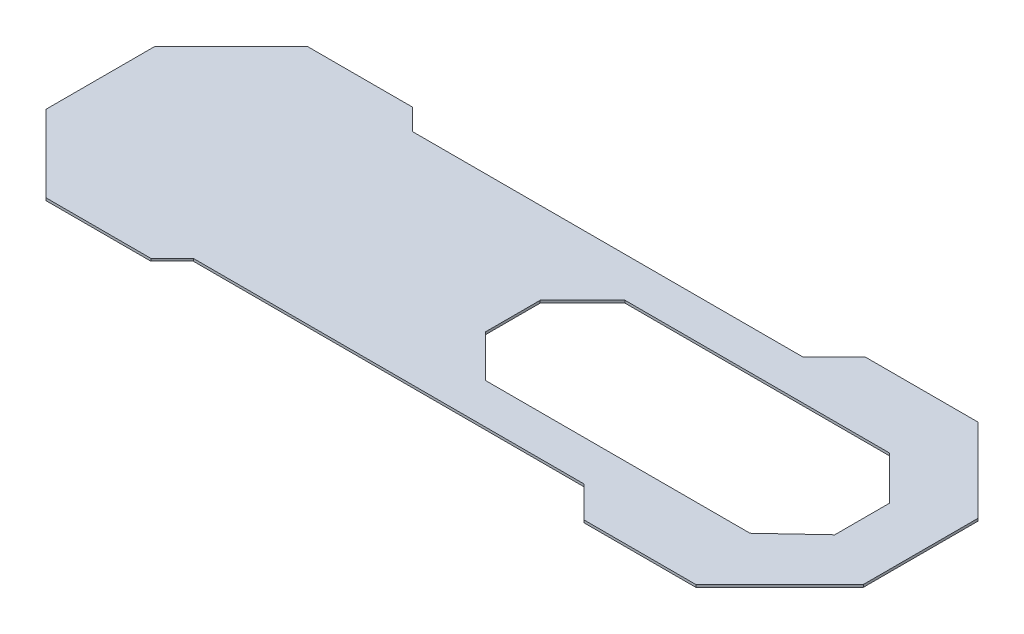
ISO-10303-21;
HEADER;
FILE_DESCRIPTION(('STEP AP214'),'2;1');
FILE_NAME('part.step','',(''),(''),'','','');
FILE_SCHEMA(('AUTOMOTIVE_DESIGN { 1 0 10303 214 1 1 1 1 }'));
ENDSEC;
DATA;
#1=APPLICATION_CONTEXT('core data for automotive mechanical design processes');
#2=APPLICATION_PROTOCOL_DEFINITION('international standard','automotive_design',2000,#1);
#3=PRODUCT_CONTEXT('',#1,'mechanical');
#4=PRODUCT('Part','Part','',(#3));
#5=PRODUCT_RELATED_PRODUCT_CATEGORY('part','',(#4));
#6=PRODUCT_DEFINITION_FORMATION('','',#4);
#7=PRODUCT_DEFINITION_CONTEXT('part definition',#1,'design');
#8=PRODUCT_DEFINITION('design','',#6,#7);
#9=PRODUCT_DEFINITION_SHAPE('','',#8);
#10=(LENGTH_UNIT() NAMED_UNIT(*) SI_UNIT(.MILLI.,.METRE.));
#11=(NAMED_UNIT(*) PLANE_ANGLE_UNIT() SI_UNIT($,.RADIAN.));
#12=(NAMED_UNIT(*) SI_UNIT($,.STERADIAN.) SOLID_ANGLE_UNIT());
#13=UNCERTAINTY_MEASURE_WITH_UNIT(LENGTH_MEASURE(1.E-05),#10,'distance_accuracy_value','');
#14=(GEOMETRIC_REPRESENTATION_CONTEXT(3) GLOBAL_UNCERTAINTY_ASSIGNED_CONTEXT((#13)) GLOBAL_UNIT_ASSIGNED_CONTEXT((#10,
#11,#12)) REPRESENTATION_CONTEXT('',''));
#15=CARTESIAN_POINT('',(0.,0.,0.));
#16=DIRECTION('',(0.,0.,1.));
#17=DIRECTION('',(1.,0.,0.));
#18=AXIS2_PLACEMENT_3D('',#15,#16,#17);
#19=CARTESIAN_POINT('',(-264.356991894611,-1.,258.389640506113));
#20=DIRECTION('',(0.,0.,1.));
#21=DIRECTION('',(1.,0.,0.));
#22=AXIS2_PLACEMENT_3D('',#19,#20,#21);
#23=PLANE('',#22);
#24=DIRECTION('',(1.,0.,0.));
#25=VECTOR('',#24,1.);
#26=CARTESIAN_POINT('',(-264.356991894611,0.,258.389640506113));
#27=LINE('',#26,#25);
#28=CARTESIAN_POINT('',(-264.356991894611,0.,258.389640506113));
#29=VERTEX_POINT('',#28);
#30=CARTESIAN_POINT('',(-222.27878140781,0.,258.389640506113));
#31=VERTEX_POINT('',#30);
#32=EDGE_CURVE('E271',#29,#31,#27,.T.);
#33=ORIENTED_EDGE('',*,*,#32,.F.);
#34=DIRECTION('',(0.,1.,0.));
#35=VECTOR('',#34,1.);
#36=CARTESIAN_POINT('',(-264.356991894611,-1.,258.389640506113));
#37=LINE('',#36,#35);
#38=CARTESIAN_POINT('',(-264.356991894611,-1.,258.389640506113));
#39=VERTEX_POINT('',#38);
#40=EDGE_CURVE('E43',#39,#29,#37,.T.);
#41=ORIENTED_EDGE('',*,*,#40,.F.);
#42=DIRECTION('',(1.,0.,0.));
#43=VECTOR('',#42,1.);
#44=CARTESIAN_POINT('',(-264.356991894611,-1.,258.389640506113));
#45=LINE('',#44,#43);
#46=CARTESIAN_POINT('',(-222.27878140781,-1.,258.389640506113));
#47=VERTEX_POINT('',#46);
#48=EDGE_CURVE('E308',#39,#47,#45,.T.);
#49=ORIENTED_EDGE('',*,*,#48,.T.);
#50=DIRECTION('',(0.,1.,0.));
#51=VECTOR('',#50,1.);
#52=CARTESIAN_POINT('',(-222.27878140781,-1.,258.389640506113));
#53=LINE('',#52,#51);
#54=EDGE_CURVE('E11',#47,#31,#53,.T.);
#55=ORIENTED_EDGE('',*,*,#54,.T.);
#56=EDGE_LOOP('',(#33,#41,#49,#55));
#57=FACE_BOUND('',#56,.T.);
#58=ADVANCED_FACE('F34',(#57),#23,.T.);
#59=CARTESIAN_POINT('',(-295.110779870024,-1.,227.635852530701));
#60=DIRECTION('',(-0.707106781186544,0.,0.707106781186551));
#61=DIRECTION('',(0.707106781186551,0.,0.707106781186544));
#62=AXIS2_PLACEMENT_3D('',#59,#60,#61);
#63=PLANE('',#62);
#64=DIRECTION('',(0.707106781186551,0.,0.707106781186544));
#65=VECTOR('',#64,1.);
#66=CARTESIAN_POINT('',(-295.110779870024,0.,227.635852530701));
#67=LINE('',#66,#65);
#68=CARTESIAN_POINT('',(-295.110779870024,0.,227.635852530701));
#69=VERTEX_POINT('',#68);
#70=EDGE_CURVE('E352',#69,#29,#67,.T.);
#71=ORIENTED_EDGE('',*,*,#70,.F.);
#72=DIRECTION('',(0.,1.,0.));
#73=VECTOR('',#72,1.);
#74=CARTESIAN_POINT('',(-295.110779870024,-1.,227.635852530701));
#75=LINE('',#74,#73);
#76=CARTESIAN_POINT('',(-295.110779870024,-1.,227.635852530701));
#77=VERTEX_POINT('',#76);
#78=EDGE_CURVE('E358',#77,#69,#75,.T.);
#79=ORIENTED_EDGE('',*,*,#78,.F.);
#80=DIRECTION('',(0.707106781186551,0.,0.707106781186544));
#81=VECTOR('',#80,1.);
#82=CARTESIAN_POINT('',(-295.110779870024,-1.,227.635852530701));
#83=LINE('',#82,#81);
#84=EDGE_CURVE('E305',#77,#39,#83,.T.);
#85=ORIENTED_EDGE('',*,*,#84,.T.);
#86=ORIENTED_EDGE('',*,*,#40,.T.);
#87=EDGE_LOOP('',(#71,#79,#85,#86));
#88=FACE_BOUND('',#87,.T.);
#89=ADVANCED_FACE('F450',(#88),#63,.T.);
#90=CARTESIAN_POINT('',(-295.110779870024,-1.,184.143428481526));
#91=DIRECTION('',(-1.,0.,0.));
#92=DIRECTION('',(0.,0.,1.));
#93=AXIS2_PLACEMENT_3D('',#90,#91,#92);
#94=PLANE('',#93);
#95=DIRECTION('',(0.,0.,1.));
#96=VECTOR('',#95,1.);
#97=CARTESIAN_POINT('',(-295.110779870024,0.,184.143428481526));
#98=LINE('',#97,#96);
#99=CARTESIAN_POINT('',(-295.110779870024,0.,184.143428481526));
#100=VERTEX_POINT('',#99);
#101=EDGE_CURVE('E349',#100,#69,#98,.T.);
#102=ORIENTED_EDGE('',*,*,#101,.F.);
#103=DIRECTION('',(0.,1.,0.));
#104=VECTOR('',#103,1.);
#105=CARTESIAN_POINT('',(-295.110779870024,-1.,184.143428481526));
#106=LINE('',#105,#104);
#107=CARTESIAN_POINT('',(-295.110779870024,-1.,184.143428481526));
#108=VERTEX_POINT('',#107);
#109=EDGE_CURVE('E360',#108,#100,#106,.T.);
#110=ORIENTED_EDGE('',*,*,#109,.F.);
#111=DIRECTION('',(0.,0.,1.));
#112=VECTOR('',#111,1.);
#113=CARTESIAN_POINT('',(-295.110779870024,-1.,184.143428481526));
#114=LINE('',#113,#112);
#115=EDGE_CURVE('E302',#108,#77,#114,.T.);
#116=ORIENTED_EDGE('',*,*,#115,.T.);
#117=ORIENTED_EDGE('',*,*,#78,.T.);
#118=EDGE_LOOP('',(#102,#110,#116,#117));
#119=FACE_BOUND('',#118,.T.);
#120=ADVANCED_FACE('F448',(#119),#94,.T.);
#121=CARTESIAN_POINT('',(-295.110779870024,-1.,184.143428481526));
#122=DIRECTION('',(-0.707106781186552,0.,-0.707106781186543));
#123=DIRECTION('',(-0.707106781186543,0.,0.707106781186552));
#124=AXIS2_PLACEMENT_3D('',#121,#122,#123);
#125=PLANE('',#124);
#126=DIRECTION('',(-0.707106781186543,0.,0.707106781186552));
#127=VECTOR('',#126,1.);
#128=CARTESIAN_POINT('',(-295.110779870024,0.,184.143428481526));
#129=LINE('',#128,#127);
#130=CARTESIAN_POINT('',(-264.356991894612,0.,153.389640506113));
#131=VERTEX_POINT('',#130);
#132=EDGE_CURVE('E346',#131,#100,#129,.T.);
#133=ORIENTED_EDGE('',*,*,#132,.F.);
#134=DIRECTION('',(0.,1.,0.));
#135=VECTOR('',#134,1.);
#136=CARTESIAN_POINT('',(-264.356991894612,-1.,153.389640506113));
#137=LINE('',#136,#135);
#138=CARTESIAN_POINT('',(-264.356991894612,-1.,153.389640506113));
#139=VERTEX_POINT('',#138);
#140=EDGE_CURVE('E362',#139,#131,#137,.T.);
#141=ORIENTED_EDGE('',*,*,#140,.F.);
#142=DIRECTION('',(-0.707106781186543,0.,0.707106781186552));
#143=VECTOR('',#142,1.);
#144=CARTESIAN_POINT('',(-295.110779870024,-1.,184.143428481526));
#145=LINE('',#144,#143);
#146=EDGE_CURVE('E299',#139,#108,#145,.T.);
#147=ORIENTED_EDGE('',*,*,#146,.T.);
#148=ORIENTED_EDGE('',*,*,#109,.T.);
#149=EDGE_LOOP('',(#133,#141,#147,#148));
#150=FACE_BOUND('',#149,.T.);
#151=ADVANCED_FACE('F444',(#150),#125,.T.);
#152=CARTESIAN_POINT('',(-264.356991894612,-1.,153.389640506113));
#153=DIRECTION('',(0.,0.,-1.));
#154=DIRECTION('',(-1.,0.,0.));
#155=AXIS2_PLACEMENT_3D('',#152,#153,#154);
#156=PLANE('',#155);
#157=DIRECTION('',(-1.,0.,0.));
#158=VECTOR('',#157,1.);
#159=CARTESIAN_POINT('',(-264.356991894612,0.,153.389640506113));
#160=LINE('',#159,#158);
#161=CARTESIAN_POINT('',(-222.27878140781,0.,153.389640506113));
#162=VERTEX_POINT('',#161);
#163=EDGE_CURVE('E343',#162,#131,#160,.T.);
#164=ORIENTED_EDGE('',*,*,#163,.F.);
#165=DIRECTION('',(0.,1.,0.));
#166=VECTOR('',#165,1.);
#167=CARTESIAN_POINT('',(-222.27878140781,-1.,153.389640506113));
#168=LINE('',#167,#166);
#169=CARTESIAN_POINT('',(-222.27878140781,-1.,153.389640506113));
#170=VERTEX_POINT('',#169);
#171=EDGE_CURVE('E364',#170,#162,#168,.T.);
#172=ORIENTED_EDGE('',*,*,#171,.F.);
#173=DIRECTION('',(-1.,0.,0.));
#174=VECTOR('',#173,1.);
#175=CARTESIAN_POINT('',(-264.356991894612,-1.,153.389640506113));
#176=LINE('',#175,#174);
#177=EDGE_CURVE('E296',#170,#139,#176,.T.);
#178=ORIENTED_EDGE('',*,*,#177,.T.);
#179=ORIENTED_EDGE('',*,*,#140,.T.);
#180=EDGE_LOOP('',(#164,#172,#178,#179));
#181=FACE_BOUND('',#180,.T.);
#182=ADVANCED_FACE('F441',(#181),#156,.T.);
#183=CARTESIAN_POINT('',(-222.27878140781,-1.,153.389640506113));
#184=DIRECTION('',(0.707106781186539,0.,-0.707106781186556));
#185=DIRECTION('',(-0.707106781186556,0.,-0.707106781186539));
#186=AXIS2_PLACEMENT_3D('',#183,#184,#185);
#187=PLANE('',#186);
#188=DIRECTION('',(-0.707106781186556,0.,-0.707106781186539));
#189=VECTOR('',#188,1.);
#190=CARTESIAN_POINT('',(-222.27878140781,0.,153.389640506113));
#191=LINE('',#190,#189);
#192=CARTESIAN_POINT('',(-213.778781407809,0.,161.889640506113));
#193=VERTEX_POINT('',#192);
#194=EDGE_CURVE('E340',#193,#162,#191,.T.);
#195=ORIENTED_EDGE('',*,*,#194,.F.);
#196=DIRECTION('',(0.,1.,0.));
#197=VECTOR('',#196,1.);
#198=CARTESIAN_POINT('',(-213.778781407809,-1.,161.889640506113));
#199=LINE('',#198,#197);
#200=CARTESIAN_POINT('',(-213.778781407809,-1.,161.889640506113));
#201=VERTEX_POINT('',#200);
#202=EDGE_CURVE('E366',#201,#193,#199,.T.);
#203=ORIENTED_EDGE('',*,*,#202,.F.);
#204=DIRECTION('',(-0.707106781186547,0.,-0.707106781186547));
#205=VECTOR('',#204,1.);
#206=CARTESIAN_POINT('',(-214.218121236029,-1.,161.450300677893));
#207=LINE('',#206,#205);
#208=EDGE_CURVE('E294',#201,#170,#207,.T.);
#209=ORIENTED_EDGE('',*,*,#208,.T.);
#210=ORIENTED_EDGE('',*,*,#171,.T.);
#211=EDGE_LOOP('',(#195,#203,#209,#210));
#212=FACE_BOUND('',#211,.T.);
#213=ADVANCED_FACE('F436',(#212),#187,.T.);
#214=CARTESIAN_POINT('',(-213.157461064249,-1.,161.889640506113));
#215=DIRECTION('',(0.,0.,-1.));
#216=DIRECTION('',(-1.,0.,0.));
#217=AXIS2_PLACEMENT_3D('',#214,#215,#216);
#218=PLANE('',#217);
#219=DIRECTION('',(-1.,0.,0.));
#220=VECTOR('',#219,1.);
#221=CARTESIAN_POINT('',(-213.157461064249,0.,161.889640506113));
#222=LINE('',#221,#220);
#223=CARTESIAN_POINT('',(-57.0996325817314,0.,161.889640506113));
#224=VERTEX_POINT('',#223);
#225=EDGE_CURVE('E337',#224,#193,#222,.T.);
#226=ORIENTED_EDGE('',*,*,#225,.F.);
#227=DIRECTION('',(0.,1.,0.));
#228=VECTOR('',#227,1.);
#229=CARTESIAN_POINT('',(-57.0996325817314,-1.,161.889640506113));
#230=LINE('',#229,#228);
#231=CARTESIAN_POINT('',(-57.0996325817314,-1.,161.889640506113));
#232=VERTEX_POINT('',#231);
#233=EDGE_CURVE('E369',#232,#224,#230,.T.);
#234=ORIENTED_EDGE('',*,*,#233,.F.);
#235=DIRECTION('',(-1.,0.,-2.68031548330951E-13));
#236=VECTOR('',#235,1.);
#237=CARTESIAN_POINT('',(-57.7209529252909,-1.,161.889640506113));
#238=LINE('',#237,#236);
#239=EDGE_CURVE('E292',#232,#201,#238,.T.);
#240=ORIENTED_EDGE('',*,*,#239,.T.);
#241=ORIENTED_EDGE('',*,*,#202,.T.);
#242=EDGE_LOOP('',(#226,#234,#240,#241));
#243=FACE_BOUND('',#242,.T.);
#244=ADVANCED_FACE('F434',(#243),#218,.T.);
#245=CARTESIAN_POINT('',(-56.6602927535113,-1.,161.450300677893));
#246=DIRECTION('',(-0.707106781186536,0.,-0.707106781186559));
#247=DIRECTION('',(-0.707106781186559,0.,0.707106781186536));
#248=AXIS2_PLACEMENT_3D('',#245,#246,#247);
#249=PLANE('',#248);
#250=DIRECTION('',(-0.707106781186559,0.,0.707106781186536));
#251=VECTOR('',#250,1.);
#252=CARTESIAN_POINT('',(-56.6602927535113,0.,161.450300677893));
#253=LINE('',#252,#251);
#254=CARTESIAN_POINT('',(-44.5996325817312,0.,149.389640506113));
#255=VERTEX_POINT('',#254);
#256=EDGE_CURVE('E334',#255,#224,#253,.T.);
#257=ORIENTED_EDGE('',*,*,#256,.F.);
#258=DIRECTION('',(0.,1.,0.));
#259=VECTOR('',#258,1.);
#260=CARTESIAN_POINT('',(-44.5996325817312,-1.,149.389640506113));
#261=LINE('',#260,#259);
#262=CARTESIAN_POINT('',(-44.5996325817312,-1.,149.389640506113));
#263=VERTEX_POINT('',#262);
#264=EDGE_CURVE('E372',#263,#255,#261,.T.);
#265=ORIENTED_EDGE('',*,*,#264,.F.);
#266=DIRECTION('',(-0.70710678118655,0.,0.707106781186545));
#267=VECTOR('',#266,1.);
#268=CARTESIAN_POINT('',(-44.5996325817312,-1.,149.389640506113));
#269=LINE('',#268,#267);
#270=EDGE_CURVE('E290',#263,#232,#269,.T.);
#271=ORIENTED_EDGE('',*,*,#270,.T.);
#272=ORIENTED_EDGE('',*,*,#233,.T.);
#273=EDGE_LOOP('',(#257,#265,#271,#272));
#274=FACE_BOUND('',#273,.T.);
#275=ADVANCED_FACE('F427',(#274),#249,.T.);
#276=CARTESIAN_POINT('',(0.478072841682279,-1.,149.389640506113));
#277=DIRECTION('',(0.,0.,-1.));
#278=DIRECTION('',(-1.,0.,0.));
#279=AXIS2_PLACEMENT_3D('',#276,#277,#278);
#280=PLANE('',#279);
#281=DIRECTION('',(-1.,0.,0.));
#282=VECTOR('',#281,1.);
#283=CARTESIAN_POINT('',(0.478072841682279,0.,149.389640506113));
#284=LINE('',#283,#282);
#285=CARTESIAN_POINT('',(0.478072841682279,0.,149.389640506113));
#286=VERTEX_POINT('',#285);
#287=EDGE_CURVE('E331',#286,#255,#284,.T.);
#288=ORIENTED_EDGE('',*,*,#287,.F.);
#289=DIRECTION('',(0.,1.,0.));
#290=VECTOR('',#289,1.);
#291=CARTESIAN_POINT('',(0.478072841682279,-1.,149.389640506113));
#292=LINE('',#291,#290);
#293=CARTESIAN_POINT('',(0.478072841682279,-1.,149.389640506113));
#294=VERTEX_POINT('',#293);
#295=EDGE_CURVE('E375',#294,#286,#292,.T.);
#296=ORIENTED_EDGE('',*,*,#295,.F.);
#297=DIRECTION('',(-1.,0.,0.));
#298=VECTOR('',#297,1.);
#299=CARTESIAN_POINT('',(0.478072841682279,-1.,149.389640506113));
#300=LINE('',#299,#298);
#301=EDGE_CURVE('E287',#294,#263,#300,.T.);
#302=ORIENTED_EDGE('',*,*,#301,.T.);
#303=ORIENTED_EDGE('',*,*,#264,.T.);
#304=EDGE_LOOP('',(#288,#296,#302,#303));
#305=FACE_BOUND('',#304,.T.);
#306=ADVANCED_FACE('F424',(#305),#280,.T.);
#307=CARTESIAN_POINT('',(33.8892201299761,-1.,182.800787794406));
#308=DIRECTION('',(0.707106781186545,0.,-0.70710678118655));
#309=DIRECTION('',(-0.70710678118655,0.,-0.707106781186545));
#310=AXIS2_PLACEMENT_3D('',#307,#308,#309);
#311=PLANE('',#310);
#312=DIRECTION('',(-0.70710678118655,0.,-0.707106781186545));
#313=VECTOR('',#312,1.);
#314=CARTESIAN_POINT('',(33.8892201299761,0.,182.800787794406));
#315=LINE('',#314,#313);
#316=CARTESIAN_POINT('',(33.8892201299761,0.,182.800787794406));
#317=VERTEX_POINT('',#316);
#318=EDGE_CURVE('E328',#317,#286,#315,.T.);
#319=ORIENTED_EDGE('',*,*,#318,.F.);
#320=DIRECTION('',(0.,1.,0.));
#321=VECTOR('',#320,1.);
#322=CARTESIAN_POINT('',(33.8892201299761,-1.,182.800787794406));
#323=LINE('',#322,#321);
#324=CARTESIAN_POINT('',(33.8892201299761,-1.,182.800787794406));
#325=VERTEX_POINT('',#324);
#326=EDGE_CURVE('E377',#325,#317,#323,.T.);
#327=ORIENTED_EDGE('',*,*,#326,.F.);
#328=DIRECTION('',(-0.70710678118655,0.,-0.707106781186545));
#329=VECTOR('',#328,1.);
#330=CARTESIAN_POINT('',(33.8892201299761,-1.,182.800787794406));
#331=LINE('',#330,#329);
#332=EDGE_CURVE('E284',#325,#294,#331,.T.);
#333=ORIENTED_EDGE('',*,*,#332,.T.);
#334=ORIENTED_EDGE('',*,*,#295,.T.);
#335=EDGE_LOOP('',(#319,#327,#333,#334));
#336=FACE_BOUND('',#335,.T.);
#337=ADVANCED_FACE('F420',(#336),#311,.T.);
#338=CARTESIAN_POINT('',(33.8892201299764,-1.,228.778493217818));
#339=DIRECTION('',(1.,0.,0.));
#340=DIRECTION('',(0.,0.,-1.));
#341=AXIS2_PLACEMENT_3D('',#338,#339,#340);
#342=PLANE('',#341);
#343=DIRECTION('',(0.,0.,-1.));
#344=VECTOR('',#343,1.);
#345=CARTESIAN_POINT('',(33.8892201299764,0.,228.778493217818));
#346=LINE('',#345,#344);
#347=CARTESIAN_POINT('',(33.8892201299764,0.,228.778493217818));
#348=VERTEX_POINT('',#347);
#349=EDGE_CURVE('E325',#348,#317,#346,.T.);
#350=ORIENTED_EDGE('',*,*,#349,.F.);
#351=DIRECTION('',(0.,1.,0.));
#352=VECTOR('',#351,1.);
#353=CARTESIAN_POINT('',(33.8892201299764,-1.,228.778493217818));
#354=LINE('',#353,#352);
#355=CARTESIAN_POINT('',(33.8892201299764,-1.,228.778493217818));
#356=VERTEX_POINT('',#355);
#357=EDGE_CURVE('E379',#356,#348,#354,.T.);
#358=ORIENTED_EDGE('',*,*,#357,.F.);
#359=DIRECTION('',(0.,0.,-1.));
#360=VECTOR('',#359,1.);
#361=CARTESIAN_POINT('',(33.8892201299764,-1.,228.778493217818));
#362=LINE('',#361,#360);
#363=EDGE_CURVE('E281',#356,#325,#362,.T.);
#364=ORIENTED_EDGE('',*,*,#363,.T.);
#365=ORIENTED_EDGE('',*,*,#326,.T.);
#366=EDGE_LOOP('',(#350,#358,#364,#365));
#367=FACE_BOUND('',#366,.T.);
#368=ADVANCED_FACE('F416',(#367),#342,.T.);
#369=CARTESIAN_POINT('',(33.8892201299764,-1.,228.778493217818));
#370=DIRECTION('',(0.70710678118655,0.,0.707106781186545));
#371=DIRECTION('',(0.707106781186545,0.,-0.70710678118655));
#372=AXIS2_PLACEMENT_3D('',#369,#370,#371);
#373=PLANE('',#372);
#374=DIRECTION('',(0.707106781186545,0.,-0.70710678118655));
#375=VECTOR('',#374,1.);
#376=CARTESIAN_POINT('',(33.8892201299764,0.,228.778493217818));
#377=LINE('',#376,#375);
#378=CARTESIAN_POINT('',(0.278072841682948,0.,262.389640506112));
#379=VERTEX_POINT('',#378);
#380=EDGE_CURVE('E322',#379,#348,#377,.T.);
#381=ORIENTED_EDGE('',*,*,#380,.F.);
#382=DIRECTION('',(0.,1.,0.));
#383=VECTOR('',#382,1.);
#384=CARTESIAN_POINT('',(0.278072841682948,-1.,262.389640506112));
#385=LINE('',#384,#383);
#386=CARTESIAN_POINT('',(0.278072841682948,-1.,262.389640506112));
#387=VERTEX_POINT('',#386);
#388=EDGE_CURVE('E381',#387,#379,#385,.T.);
#389=ORIENTED_EDGE('',*,*,#388,.F.);
#390=DIRECTION('',(0.707106781186545,0.,-0.70710678118655));
#391=VECTOR('',#390,1.);
#392=CARTESIAN_POINT('',(33.8892201299764,-1.,228.778493217818));
#393=LINE('',#392,#391);
#394=EDGE_CURVE('E278',#387,#356,#393,.T.);
#395=ORIENTED_EDGE('',*,*,#394,.T.);
#396=ORIENTED_EDGE('',*,*,#357,.T.);
#397=EDGE_LOOP('',(#381,#389,#395,#396));
#398=FACE_BOUND('',#397,.T.);
#399=ADVANCED_FACE('F412',(#398),#373,.T.);
#400=CARTESIAN_POINT('',(-44.5996325817311,-1.,262.389640506112));
#401=DIRECTION('',(0.,0.,1.));
#402=DIRECTION('',(1.,0.,0.));
#403=AXIS2_PLACEMENT_3D('',#400,#401,#402);
#404=PLANE('',#403);
#405=DIRECTION('',(1.,0.,0.));
#406=VECTOR('',#405,1.);
#407=CARTESIAN_POINT('',(-44.5996325817311,0.,262.389640506112));
#408=LINE('',#407,#406);
#409=CARTESIAN_POINT('',(-44.5996325817311,0.,262.389640506112));
#410=VERTEX_POINT('',#409);
#411=EDGE_CURVE('E319',#410,#379,#408,.T.);
#412=ORIENTED_EDGE('',*,*,#411,.F.);
#413=DIRECTION('',(0.,1.,0.));
#414=VECTOR('',#413,1.);
#415=CARTESIAN_POINT('',(-44.5996325817311,-1.,262.389640506112));
#416=LINE('',#415,#414);
#417=CARTESIAN_POINT('',(-44.5996325817311,-1.,262.389640506112));
#418=VERTEX_POINT('',#417);
#419=EDGE_CURVE('E383',#418,#410,#416,.T.);
#420=ORIENTED_EDGE('',*,*,#419,.F.);
#421=DIRECTION('',(1.,0.,0.));
#422=VECTOR('',#421,1.);
#423=CARTESIAN_POINT('',(-44.5996325817311,-1.,262.389640506112));
#424=LINE('',#423,#422);
#425=EDGE_CURVE('E275',#418,#387,#424,.T.);
#426=ORIENTED_EDGE('',*,*,#425,.T.);
#427=ORIENTED_EDGE('',*,*,#388,.T.);
#428=EDGE_LOOP('',(#412,#420,#426,#427));
#429=FACE_BOUND('',#428,.T.);
#430=ADVANCED_FACE('F409',(#429),#404,.T.);
#431=CARTESIAN_POINT('',(-56.6602927535107,-1.,250.328980334333));
#432=DIRECTION('',(-0.70710678118655,0.,0.707106781186545));
#433=DIRECTION('',(0.707106781186545,0.,0.70710678118655));
#434=AXIS2_PLACEMENT_3D('',#431,#432,#433);
#435=PLANE('',#434);
#436=DIRECTION('',(0.707106781186545,0.,0.70710678118655));
#437=VECTOR('',#436,1.);
#438=CARTESIAN_POINT('',(-56.6602927535107,0.,250.328980334333));
#439=LINE('',#438,#437);
#440=CARTESIAN_POINT('',(-57.099632581731,0.,249.889640506112));
#441=VERTEX_POINT('',#440);
#442=EDGE_CURVE('E316',#441,#410,#439,.T.);
#443=ORIENTED_EDGE('',*,*,#442,.F.);
#444=DIRECTION('',(0.,1.,0.));
#445=VECTOR('',#444,1.);
#446=CARTESIAN_POINT('',(-57.099632581731,-1.,249.889640506112));
#447=LINE('',#446,#445);
#448=CARTESIAN_POINT('',(-57.099632581731,-1.,249.889640506112));
#449=VERTEX_POINT('',#448);
#450=EDGE_CURVE('E384',#449,#441,#447,.T.);
#451=ORIENTED_EDGE('',*,*,#450,.F.);
#452=DIRECTION('',(0.707106781186603,0.,0.707106781186492));
#453=VECTOR('',#452,1.);
#454=CARTESIAN_POINT('',(-56.6602927535107,-1.,250.328980334333));
#455=LINE('',#454,#453);
#456=EDGE_CURVE('E273',#449,#418,#455,.T.);
#457=ORIENTED_EDGE('',*,*,#456,.T.);
#458=ORIENTED_EDGE('',*,*,#419,.T.);
#459=EDGE_LOOP('',(#443,#451,#457,#458));
#460=FACE_BOUND('',#459,.T.);
#461=ADVANCED_FACE('F404',(#460),#435,.T.);
#462=CARTESIAN_POINT('',(-57.7209529252905,-1.,249.889640506112));
#463=DIRECTION('',(0.,0.,1.));
#464=DIRECTION('',(1.,0.,0.));
#465=AXIS2_PLACEMENT_3D('',#462,#463,#464);
#466=PLANE('',#465);
#467=DIRECTION('',(1.,0.,0.));
#468=VECTOR('',#467,1.);
#469=CARTESIAN_POINT('',(-57.7209529252905,0.,249.889640506112));
#470=LINE('',#469,#468);
#471=CARTESIAN_POINT('',(-213.77878140781,0.,249.889640506113));
#472=VERTEX_POINT('',#471);
#473=EDGE_CURVE('E313',#472,#441,#470,.T.);
#474=ORIENTED_EDGE('',*,*,#473,.F.);
#475=DIRECTION('',(0.,1.,0.));
#476=VECTOR('',#475,1.);
#477=CARTESIAN_POINT('',(-213.77878140781,-1.,249.889640506113));
#478=LINE('',#477,#476);
#479=CARTESIAN_POINT('',(-213.77878140781,-1.,249.889640506113));
#480=VERTEX_POINT('',#479);
#481=EDGE_CURVE('E38',#480,#472,#478,.T.);
#482=ORIENTED_EDGE('',*,*,#481,.F.);
#483=DIRECTION('',(1.,0.,0.));
#484=VECTOR('',#483,1.);
#485=CARTESIAN_POINT('',(-213.15746106425,-1.,249.889640506113));
#486=LINE('',#485,#484);
#487=EDGE_CURVE('E270',#480,#449,#486,.T.);
#488=ORIENTED_EDGE('',*,*,#487,.T.);
#489=ORIENTED_EDGE('',*,*,#450,.T.);
#490=EDGE_LOOP('',(#474,#482,#488,#489));
#491=FACE_BOUND('',#490,.T.);
#492=ADVANCED_FACE('F402',(#491),#466,.T.);
#493=CARTESIAN_POINT('',(-214.21812123603,-1.,250.328980334333));
#494=DIRECTION('',(0.707106781186547,0.,0.707106781186547));
#495=DIRECTION('',(0.707106781186548,0.,-0.707106781186548));
#496=AXIS2_PLACEMENT_3D('',#493,#494,#495);
#497=PLANE('',#496);
#498=DIRECTION('',(0.707106781186548,0.,-0.707106781186548));
#499=VECTOR('',#498,1.);
#500=CARTESIAN_POINT('',(-214.21812123603,0.,250.328980334333));
#501=LINE('',#500,#499);
#502=EDGE_CURVE('E267',#31,#472,#501,.T.);
#503=ORIENTED_EDGE('',*,*,#502,.F.);
#504=ORIENTED_EDGE('',*,*,#54,.F.);
#505=DIRECTION('',(0.707106781186544,0.,-0.707106781186551));
#506=VECTOR('',#505,1.);
#507=CARTESIAN_POINT('',(-222.27878140781,-1.,258.389640506113));
#508=LINE('',#507,#506);
#509=EDGE_CURVE('E268',#47,#480,#508,.T.);
#510=ORIENTED_EDGE('',*,*,#509,.T.);
#511=ORIENTED_EDGE('',*,*,#481,.T.);
#512=EDGE_LOOP('',(#503,#504,#510,#511));
#513=FACE_BOUND('',#512,.T.);
#514=ADVANCED_FACE('F36',(#513),#497,.T.);
#515=CARTESIAN_POINT('',(0.,-1.,0.));
#516=DIRECTION('',(0.,1.,0.));
#517=DIRECTION('',(0.,0.,1.));
#518=AXIS2_PLACEMENT_3D('',#515,#516,#517);
#519=PLANE('',#518);
#520=DIRECTION('',(-0.707106781186549,0.,-0.707106781186546));
#521=VECTOR('',#520,1.);
#522=CARTESIAN_POINT('',(-92.249699274949,-1.,92.2496992749494));
#523=LINE('',#522,#521);
#524=CARTESIAN_POINT('',(10.895241956214,-0.999999999999999,195.394640506112));
#525=VERTEX_POINT('',#524);
#526=CARTESIAN_POINT('',(-6.63291149814031,-0.999999999999999,177.866487051758));
#527=VERTEX_POINT('',#526);
#528=EDGE_CURVE('E261',#525,#527,#523,.T.);
#529=ORIENTED_EDGE('',*,*,#528,.T.);
#530=DIRECTION('',(-1.,0.,0.));
#531=VECTOR('',#530,1.);
#532=CARTESIAN_POINT('',(-3.72484235232924E-13,-1.,177.866487051758));
#533=LINE('',#532,#531);
#534=CARTESIAN_POINT('',(-112.662348749663,-0.999999999999999,177.866487051758));
#535=VERTEX_POINT('',#534);
#536=EDGE_CURVE('E264',#527,#535,#533,.T.);
#537=ORIENTED_EDGE('',*,*,#536,.T.);
#538=DIRECTION('',(-0.707106781186544,0.,0.707106781186551));
#539=VECTOR('',#538,1.);
#540=CARTESIAN_POINT('',(32.6020691510467,-1.,32.6020691510464));
#541=LINE('',#540,#539);
#542=CARTESIAN_POINT('',(-129.650630123902,-1.,194.854768425997));
#543=VERTEX_POINT('',#542);
#544=EDGE_CURVE('E236',#535,#543,#541,.T.);
#545=ORIENTED_EDGE('',*,*,#544,.T.);
#546=DIRECTION('',(0.,0.,1.));
#547=VECTOR('',#546,1.);
#548=CARTESIAN_POINT('',(-129.650630123903,-1.,4.93630996547507E-13));
#549=LINE('',#548,#547);
#550=CARTESIAN_POINT('',(-129.650630123902,-0.999999999999999,216.724512586227));
#551=VERTEX_POINT('',#550);
#552=EDGE_CURVE('E203',#543,#551,#549,.T.);
#553=ORIENTED_EDGE('',*,*,#552,.T.);
#554=DIRECTION('',(0.707106781186551,0.,0.707106781186544));
#555=VECTOR('',#554,1.);
#556=CARTESIAN_POINT('',(-173.187571355064,-1.,173.187571355066));
#557=LINE('',#556,#555);
#558=CARTESIAN_POINT('',(-112.662389705895,-0.999999999999999,233.712753004234));
#559=VERTEX_POINT('',#558);
#560=EDGE_CURVE('E249',#551,#559,#557,.T.);
#561=ORIENTED_EDGE('',*,*,#560,.T.);
#562=DIRECTION('',(1.,0.,0.));
#563=VECTOR('',#562,1.);
#564=CARTESIAN_POINT('',(9.17696854871659E-13,-1.,233.712753004234));
#565=LINE('',#564,#563);
#566=CARTESIAN_POINT('',(-6.6333897058949,-0.999999999999999,233.712753004234));
#567=VERTEX_POINT('',#566);
#568=EDGE_CURVE('E252',#559,#567,#565,.T.);
#569=ORIENTED_EDGE('',*,*,#568,.T.);
#570=DIRECTION('',(0.72923797083183,0.,-0.684260171204693));
#571=VECTOR('',#570,1.);
#572=CARTESIAN_POINT('',(113.514143224176,-1.,120.975656554397));
#573=LINE('',#572,#571);
#574=CARTESIAN_POINT('',(10.8952419562142,-0.999999999999999,217.265248922106));
#575=VERTEX_POINT('',#574);
#576=EDGE_CURVE('E255',#567,#575,#573,.T.);
#577=ORIENTED_EDGE('',*,*,#576,.T.);
#578=DIRECTION('',(0.,0.,-1.));
#579=VECTOR('',#578,1.);
#580=CARTESIAN_POINT('',(10.8952419562125,-1.,0.));
#581=LINE('',#580,#579);
#582=EDGE_CURVE('E258',#575,#525,#581,.T.);
#583=ORIENTED_EDGE('',*,*,#582,.T.);
#584=EDGE_LOOP('',(#529,#537,#545,#553,#561,#569,#577,#583));
#585=FACE_BOUND('',#584,.T.);
#586=ORIENTED_EDGE('',*,*,#509,.F.);
#587=ORIENTED_EDGE('',*,*,#48,.F.);
#588=ORIENTED_EDGE('',*,*,#84,.F.);
#589=ORIENTED_EDGE('',*,*,#115,.F.);
#590=ORIENTED_EDGE('',*,*,#146,.F.);
#591=ORIENTED_EDGE('',*,*,#177,.F.);
#592=ORIENTED_EDGE('',*,*,#208,.F.);
#593=ORIENTED_EDGE('',*,*,#239,.F.);
#594=ORIENTED_EDGE('',*,*,#270,.F.);
#595=ORIENTED_EDGE('',*,*,#301,.F.);
#596=ORIENTED_EDGE('',*,*,#332,.F.);
#597=ORIENTED_EDGE('',*,*,#363,.F.);
#598=ORIENTED_EDGE('',*,*,#394,.F.);
#599=ORIENTED_EDGE('',*,*,#425,.F.);
#600=ORIENTED_EDGE('',*,*,#456,.F.);
#601=ORIENTED_EDGE('',*,*,#487,.F.);
#602=EDGE_LOOP('',(#586,#587,#588,#589,#590,#591,#592,#593,#594,#595,#596,#597,#598,#599,#600,#601));
#603=FACE_BOUND('',#602,.T.);
#604=ADVANCED_FACE('F398',(#585,#603),#519,.F.);
#605=CARTESIAN_POINT('',(0.,0.,0.));
#606=DIRECTION('',(0.,1.,0.));
#607=DIRECTION('',(0.,0.,1.));
#608=AXIS2_PLACEMENT_3D('',#605,#606,#607);
#609=PLANE('',#608);
#610=DIRECTION('',(-1.,0.,0.));
#611=VECTOR('',#610,1.);
#612=CARTESIAN_POINT('',(-112.662348749663,0.,177.866487051758));
#613=LINE('',#612,#611);
#614=CARTESIAN_POINT('',(-6.63291149814031,0.,177.866487051758));
#615=VERTEX_POINT('',#614);
#616=CARTESIAN_POINT('',(-112.662348749663,0.,177.866487051758));
#617=VERTEX_POINT('',#616);
#618=EDGE_CURVE('E59',#615,#617,#613,.T.);
#619=ORIENTED_EDGE('',*,*,#618,.F.);
#620=DIRECTION('',(-0.707106781186549,0.,-0.707106781186546));
#621=VECTOR('',#620,1.);
#622=CARTESIAN_POINT('',(-6.63291149814031,0.,177.866487051758));
#623=LINE('',#622,#621);
#624=CARTESIAN_POINT('',(10.895241956214,0.,195.394640506112));
#625=VERTEX_POINT('',#624);
#626=EDGE_CURVE('E231',#625,#615,#623,.T.);
#627=ORIENTED_EDGE('',*,*,#626,.F.);
#628=DIRECTION('',(0.,0.,-1.));
#629=VECTOR('',#628,1.);
#630=CARTESIAN_POINT('',(10.895241956214,0.,195.394640506112));
#631=LINE('',#630,#629);
#632=CARTESIAN_POINT('',(10.8952419562142,0.,217.265248922106));
#633=VERTEX_POINT('',#632);
#634=EDGE_CURVE('E228',#633,#625,#631,.T.);
#635=ORIENTED_EDGE('',*,*,#634,.F.);
#636=DIRECTION('',(0.72923797083183,0.,-0.684260171204693));
#637=VECTOR('',#636,1.);
#638=CARTESIAN_POINT('',(10.8952419562142,0.,217.265248922106));
#639=LINE('',#638,#637);
#640=CARTESIAN_POINT('',(-6.6333897058949,0.,233.712753004234));
#641=VERTEX_POINT('',#640);
#642=EDGE_CURVE('E225',#641,#633,#639,.T.);
#643=ORIENTED_EDGE('',*,*,#642,.F.);
#644=DIRECTION('',(1.,0.,0.));
#645=VECTOR('',#644,1.);
#646=CARTESIAN_POINT('',(-6.6333897058949,0.,233.712753004234));
#647=LINE('',#646,#645);
#648=CARTESIAN_POINT('',(-112.662389705895,0.,233.712753004234));
#649=VERTEX_POINT('',#648);
#650=EDGE_CURVE('E219',#649,#641,#647,.T.);
#651=ORIENTED_EDGE('',*,*,#650,.F.);
#652=DIRECTION('',(0.707106781186551,0.,0.707106781186544));
#653=VECTOR('',#652,1.);
#654=CARTESIAN_POINT('',(-112.662389705895,0.,233.712753004234));
#655=LINE('',#654,#653);
#656=CARTESIAN_POINT('',(-129.650630123902,0.,216.724512586227));
#657=VERTEX_POINT('',#656);
#658=EDGE_CURVE('E217',#657,#649,#655,.T.);
#659=ORIENTED_EDGE('',*,*,#658,.F.);
#660=DIRECTION('',(0.,0.,1.));
#661=VECTOR('',#660,1.);
#662=CARTESIAN_POINT('',(-129.650630123902,0.,216.724512586227));
#663=LINE('',#662,#661);
#664=CARTESIAN_POINT('',(-129.650630123902,0.,194.854768425997));
#665=VERTEX_POINT('',#664);
#666=EDGE_CURVE('E200',#665,#657,#663,.T.);
#667=ORIENTED_EDGE('',*,*,#666,.F.);
#668=DIRECTION('',(-0.707106781186544,0.,0.707106781186551));
#669=VECTOR('',#668,1.);
#670=CARTESIAN_POINT('',(-129.650630123902,0.,194.854768425997));
#671=LINE('',#670,#669);
#672=EDGE_CURVE('E209',#617,#665,#671,.T.);
#673=ORIENTED_EDGE('',*,*,#672,.F.);
#674=EDGE_LOOP('',(#619,#627,#635,#643,#651,#659,#667,#673));
#675=FACE_BOUND('',#674,.T.);
#676=ORIENTED_EDGE('',*,*,#32,.T.);
#677=ORIENTED_EDGE('',*,*,#502,.T.);
#678=ORIENTED_EDGE('',*,*,#473,.T.);
#679=ORIENTED_EDGE('',*,*,#442,.T.);
#680=ORIENTED_EDGE('',*,*,#411,.T.);
#681=ORIENTED_EDGE('',*,*,#380,.T.);
#682=ORIENTED_EDGE('',*,*,#349,.T.);
#683=ORIENTED_EDGE('',*,*,#318,.T.);
#684=ORIENTED_EDGE('',*,*,#287,.T.);
#685=ORIENTED_EDGE('',*,*,#256,.T.);
#686=ORIENTED_EDGE('',*,*,#225,.T.);
#687=ORIENTED_EDGE('',*,*,#194,.T.);
#688=ORIENTED_EDGE('',*,*,#163,.T.);
#689=ORIENTED_EDGE('',*,*,#132,.T.);
#690=ORIENTED_EDGE('',*,*,#101,.T.);
#691=ORIENTED_EDGE('',*,*,#70,.T.);
#692=EDGE_LOOP('',(#676,#677,#678,#679,#680,#681,#682,#683,#684,#685,#686,#687,#688,#689,#690,#691));
#693=FACE_BOUND('',#692,.T.);
#694=ADVANCED_FACE('F213',(#675,#693),#609,.T.);
#695=CARTESIAN_POINT('',(-112.662348749663,-10.,177.866487051758));
#696=DIRECTION('',(0.,0.,-1.));
#697=DIRECTION('',(-1.,0.,0.));
#698=AXIS2_PLACEMENT_3D('',#695,#696,#697);
#699=PLANE('',#698);
#700=DIRECTION('',(0.,1.,0.));
#701=VECTOR('',#700,1.);
#702=CARTESIAN_POINT('',(-6.63291149814031,-10.,177.866487051758));
#703=LINE('',#702,#701);
#704=EDGE_CURVE('E234',#527,#615,#703,.T.);
#705=ORIENTED_EDGE('',*,*,#704,.T.);
#706=ORIENTED_EDGE('',*,*,#618,.T.);
#707=DIRECTION('',(0.,1.,0.));
#708=VECTOR('',#707,1.);
#709=CARTESIAN_POINT('',(-112.662348749663,-10.,177.866487051758));
#710=LINE('',#709,#708);
#711=EDGE_CURVE('E206',#535,#617,#710,.T.);
#712=ORIENTED_EDGE('',*,*,#711,.F.);
#713=ORIENTED_EDGE('',*,*,#536,.F.);
#714=EDGE_LOOP('',(#705,#706,#712,#713));
#715=FACE_BOUND('',#714,.T.);
#716=ADVANCED_FACE('F494',(#715),#699,.F.);
#717=CARTESIAN_POINT('',(-6.63291149814031,-10.,177.866487051758));
#718=DIRECTION('',(0.707106781186546,0.,-0.707106781186549));
#719=DIRECTION('',(-0.707106781186549,0.,-0.707106781186546));
#720=AXIS2_PLACEMENT_3D('',#717,#718,#719);
#721=PLANE('',#720);
#722=DIRECTION('',(0.,1.,0.));
#723=VECTOR('',#722,1.);
#724=CARTESIAN_POINT('',(10.895241956214,-10.,195.394640506112));
#725=LINE('',#724,#723);
#726=EDGE_CURVE('E237',#525,#625,#725,.T.);
#727=ORIENTED_EDGE('',*,*,#726,.T.);
#728=ORIENTED_EDGE('',*,*,#626,.T.);
#729=ORIENTED_EDGE('',*,*,#704,.F.);
#730=ORIENTED_EDGE('',*,*,#528,.F.);
#731=EDGE_LOOP('',(#727,#728,#729,#730));
#732=FACE_BOUND('',#731,.T.);
#733=ADVANCED_FACE('F498',(#732),#721,.F.);
#734=CARTESIAN_POINT('',(10.895241956214,-10.,195.394640506112));
#735=DIRECTION('',(1.,0.,0.));
#736=DIRECTION('',(0.,0.,-1.));
#737=AXIS2_PLACEMENT_3D('',#734,#735,#736);
#738=PLANE('',#737);
#739=DIRECTION('',(0.,1.,0.));
#740=VECTOR('',#739,1.);
#741=CARTESIAN_POINT('',(10.8952419562142,-10.,217.265248922106));
#742=LINE('',#741,#740);
#743=EDGE_CURVE('E239',#575,#633,#742,.T.);
#744=ORIENTED_EDGE('',*,*,#743,.T.);
#745=ORIENTED_EDGE('',*,*,#634,.T.);
#746=ORIENTED_EDGE('',*,*,#726,.F.);
#747=ORIENTED_EDGE('',*,*,#582,.F.);
#748=EDGE_LOOP('',(#744,#745,#746,#747));
#749=FACE_BOUND('',#748,.T.);
#750=ADVANCED_FACE('F514',(#749),#738,.F.);
#751=CARTESIAN_POINT('',(10.8952419562142,-10.,217.265248922106));
#752=DIRECTION('',(0.684260171204693,0.,0.72923797083183));
#753=DIRECTION('',(0.72923797083183,0.,-0.684260171204693));
#754=AXIS2_PLACEMENT_3D('',#751,#752,#753);
#755=PLANE('',#754);
#756=DIRECTION('',(0.,1.,0.));
#757=VECTOR('',#756,1.);
#758=CARTESIAN_POINT('',(-6.6333897058949,-10.,233.712753004234));
#759=LINE('',#758,#757);
#760=EDGE_CURVE('E241',#567,#641,#759,.T.);
#761=ORIENTED_EDGE('',*,*,#760,.T.);
#762=ORIENTED_EDGE('',*,*,#642,.T.);
#763=ORIENTED_EDGE('',*,*,#743,.F.);
#764=ORIENTED_EDGE('',*,*,#576,.F.);
#765=EDGE_LOOP('',(#761,#762,#763,#764));
#766=FACE_BOUND('',#765,.T.);
#767=ADVANCED_FACE('F510',(#766),#755,.F.);
#768=CARTESIAN_POINT('',(-6.6333897058949,-10.,233.712753004234));
#769=DIRECTION('',(0.,0.,1.));
#770=DIRECTION('',(1.,0.,0.));
#771=AXIS2_PLACEMENT_3D('',#768,#769,#770);
#772=PLANE('',#771);
#773=DIRECTION('',(0.,1.,0.));
#774=VECTOR('',#773,1.);
#775=CARTESIAN_POINT('',(-112.662389705895,-10.,233.712753004234));
#776=LINE('',#775,#774);
#777=EDGE_CURVE('E243',#559,#649,#776,.T.);
#778=ORIENTED_EDGE('',*,*,#777,.T.);
#779=ORIENTED_EDGE('',*,*,#650,.T.);
#780=ORIENTED_EDGE('',*,*,#760,.F.);
#781=ORIENTED_EDGE('',*,*,#568,.F.);
#782=EDGE_LOOP('',(#778,#779,#780,#781));
#783=FACE_BOUND('',#782,.T.);
#784=ADVANCED_FACE('F506',(#783),#772,.F.);
#785=CARTESIAN_POINT('',(-112.662389705895,-10.,233.712753004234));
#786=DIRECTION('',(-0.707106781186544,0.,0.707106781186551));
#787=DIRECTION('',(0.707106781186551,0.,0.707106781186544));
#788=AXIS2_PLACEMENT_3D('',#785,#786,#787);
#789=PLANE('',#788);
#790=DIRECTION('',(0.,1.,0.));
#791=VECTOR('',#790,1.);
#792=CARTESIAN_POINT('',(-129.650630123902,-10.,216.724512586227));
#793=LINE('',#792,#791);
#794=EDGE_CURVE('E205',#551,#657,#793,.T.);
#795=ORIENTED_EDGE('',*,*,#794,.T.);
#796=ORIENTED_EDGE('',*,*,#658,.T.);
#797=ORIENTED_EDGE('',*,*,#777,.F.);
#798=ORIENTED_EDGE('',*,*,#560,.F.);
#799=EDGE_LOOP('',(#795,#796,#797,#798));
#800=FACE_BOUND('',#799,.T.);
#801=ADVANCED_FACE('F503',(#800),#789,.F.);
#802=CARTESIAN_POINT('',(-129.650630123902,-10.,216.724512586227));
#803=DIRECTION('',(-1.,0.,0.));
#804=DIRECTION('',(0.,0.,1.));
#805=AXIS2_PLACEMENT_3D('',#802,#803,#804);
#806=PLANE('',#805);
#807=DIRECTION('',(0.,1.,0.));
#808=VECTOR('',#807,1.);
#809=CARTESIAN_POINT('',(-129.650630123902,-10.,194.854768425997));
#810=LINE('',#809,#808);
#811=EDGE_CURVE('E51',#543,#665,#810,.T.);
#812=ORIENTED_EDGE('',*,*,#811,.T.);
#813=ORIENTED_EDGE('',*,*,#666,.T.);
#814=ORIENTED_EDGE('',*,*,#794,.F.);
#815=ORIENTED_EDGE('',*,*,#552,.F.);
#816=EDGE_LOOP('',(#812,#813,#814,#815));
#817=FACE_BOUND('',#816,.T.);
#818=ADVANCED_FACE('F197',(#817),#806,.F.);
#819=CARTESIAN_POINT('',(-129.650630123902,-10.,194.854768425997));
#820=DIRECTION('',(-0.707106781186551,0.,-0.707106781186544));
#821=DIRECTION('',(-0.707106781186544,0.,0.707106781186551));
#822=AXIS2_PLACEMENT_3D('',#819,#820,#821);
#823=PLANE('',#822);
#824=ORIENTED_EDGE('',*,*,#711,.T.);
#825=ORIENTED_EDGE('',*,*,#672,.T.);
#826=ORIENTED_EDGE('',*,*,#811,.F.);
#827=ORIENTED_EDGE('',*,*,#544,.F.);
#828=EDGE_LOOP('',(#824,#825,#826,#827));
#829=FACE_BOUND('',#828,.T.);
#830=ADVANCED_FACE('F210',(#829),#823,.F.);
#831=CLOSED_SHELL('',(#58,#89,#120,#151,#182,#213,#244,#275,#306,#337,#368,#399,#430,#461,#492,
#514,#604,#694,#716,#733,#750,#767,#784,#801,#818,#830));
#832=MANIFOLD_SOLID_BREP('B2',#831);
#833=ADVANCED_BREP_SHAPE_REPRESENTATION('',(#18,#832),#14);
#834=SHAPE_DEFINITION_REPRESENTATION(#9,#833);
ENDSEC;
END-ISO-10303-21;
